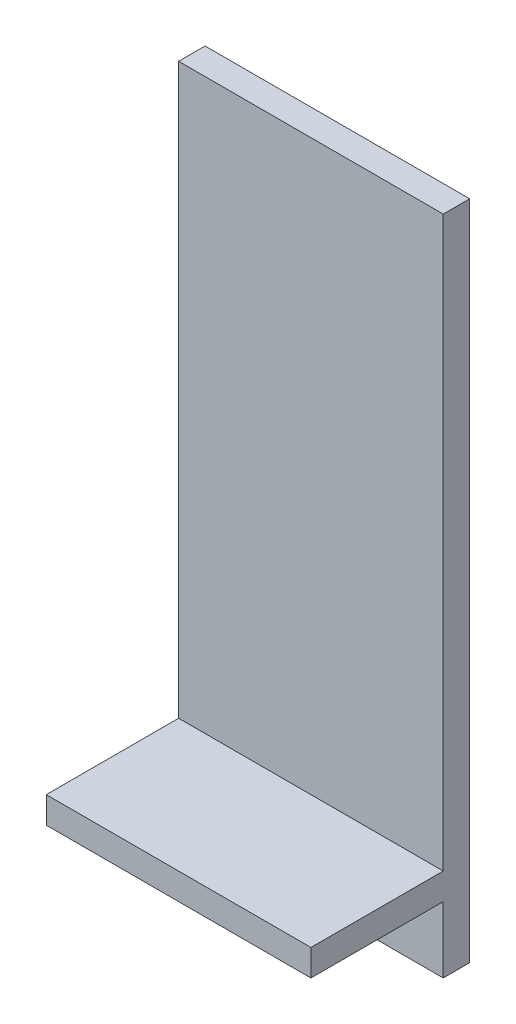
ISO-10303-21;
HEADER;
FILE_DESCRIPTION(('STEP AP214'),'2;1');
FILE_NAME('part.step','',(''),(''),'','','');
FILE_SCHEMA(('AUTOMOTIVE_DESIGN { 1 0 10303 214 1 1 1 1 }'));
ENDSEC;
DATA;
#1=APPLICATION_CONTEXT('core data for automotive mechanical design processes');
#2=APPLICATION_PROTOCOL_DEFINITION('international standard','automotive_design',2000,#1);
#3=PRODUCT_CONTEXT('',#1,'mechanical');
#4=PRODUCT('Part','Part','',(#3));
#5=PRODUCT_RELATED_PRODUCT_CATEGORY('part','',(#4));
#6=PRODUCT_DEFINITION_FORMATION('','',#4);
#7=PRODUCT_DEFINITION_CONTEXT('part definition',#1,'design');
#8=PRODUCT_DEFINITION('design','',#6,#7);
#9=PRODUCT_DEFINITION_SHAPE('','',#8);
#10=(LENGTH_UNIT() NAMED_UNIT(*) SI_UNIT(.MILLI.,.METRE.));
#11=(NAMED_UNIT(*) PLANE_ANGLE_UNIT() SI_UNIT($,.RADIAN.));
#12=(NAMED_UNIT(*) SI_UNIT($,.STERADIAN.) SOLID_ANGLE_UNIT());
#13=UNCERTAINTY_MEASURE_WITH_UNIT(LENGTH_MEASURE(1.E-05),#10,'distance_accuracy_value','');
#14=(GEOMETRIC_REPRESENTATION_CONTEXT(3) GLOBAL_UNCERTAINTY_ASSIGNED_CONTEXT((#13)) GLOBAL_UNIT_ASSIGNED_CONTEXT((#10,
#11,#12)) REPRESENTATION_CONTEXT('',''));
#15=CARTESIAN_POINT('',(0.,0.,0.));
#16=DIRECTION('',(0.,0.,1.));
#17=DIRECTION('',(1.,0.,0.));
#18=AXIS2_PLACEMENT_3D('',#15,#16,#17);
#19=CARTESIAN_POINT('',(0.,50.,0.));
#20=DIRECTION('',(0.,0.,-1.));
#21=DIRECTION('',(-1.,0.,0.));
#22=AXIS2_PLACEMENT_3D('',#19,#20,#21);
#23=PLANE('',#22);
#24=DIRECTION('',(1.,0.,0.));
#25=VECTOR('',#24,1.);
#26=CARTESIAN_POINT('',(12.,5.,0.));
#27=LINE('',#26,#25);
#28=CARTESIAN_POINT('',(0.,5.,0.));
#29=VERTEX_POINT('',#28);
#30=CARTESIAN_POINT('',(8.,5.,0.));
#31=VERTEX_POINT('',#30);
#32=EDGE_CURVE('E153',#29,#31,#27,.T.);
#33=ORIENTED_EDGE('',*,*,#32,.F.);
#34=DIRECTION('',(0.,-1.,0.));
#35=VECTOR('',#34,1.);
#36=CARTESIAN_POINT('',(0.,50.,0.));
#37=LINE('',#36,#35);
#38=CARTESIAN_POINT('',(0.,0.,0.));
#39=VERTEX_POINT('',#38);
#40=EDGE_CURVE('E41',#29,#39,#37,.T.);
#41=ORIENTED_EDGE('',*,*,#40,.T.);
#42=DIRECTION('',(1.,0.,0.));
#43=VECTOR('',#42,1.);
#44=CARTESIAN_POINT('',(0.,0.,0.));
#45=LINE('',#44,#43);
#46=CARTESIAN_POINT('',(8.,0.,0.));
#47=VERTEX_POINT('',#46);
#48=EDGE_CURVE('E56',#39,#47,#45,.T.);
#49=ORIENTED_EDGE('',*,*,#48,.T.);
#50=DIRECTION('',(0.,-1.,0.));
#51=VECTOR('',#50,1.);
#52=CARTESIAN_POINT('',(8.,0.,0.));
#53=LINE('',#52,#51);
#54=EDGE_CURVE('E165',#31,#47,#53,.T.);
#55=ORIENTED_EDGE('',*,*,#54,.F.);
#56=EDGE_LOOP('',(#33,#41,#49,#55));
#57=FACE_BOUND('',#56,.T.);
#58=ADVANCED_FACE('F33',(#57),#23,.F.);
#59=CARTESIAN_POINT('',(12.,5.,0.));
#60=VERTEX_POINT('',#59);
#61=CARTESIAN_POINT('',(20.,5.,0.));
#62=VERTEX_POINT('',#61);
#63=EDGE_CURVE('E139',#60,#62,#27,.T.);
#64=ORIENTED_EDGE('',*,*,#63,.F.);
#65=DIRECTION('',(0.,1.,0.));
#66=VECTOR('',#65,1.);
#67=CARTESIAN_POINT('',(12.,5.,0.));
#68=LINE('',#67,#66);
#69=CARTESIAN_POINT('',(12.,0.,0.));
#70=VERTEX_POINT('',#69);
#71=EDGE_CURVE('E48',#70,#60,#68,.T.);
#72=ORIENTED_EDGE('',*,*,#71,.F.);
#73=CARTESIAN_POINT('',(20.,0.,0.));
#74=VERTEX_POINT('',#73);
#75=EDGE_CURVE('E200',#70,#74,#45,.T.);
#76=ORIENTED_EDGE('',*,*,#75,.T.);
#77=DIRECTION('',(0.,-1.,0.));
#78=VECTOR('',#77,1.);
#79=CARTESIAN_POINT('',(20.,50.,0.));
#80=LINE('',#79,#78);
#81=EDGE_CURVE('E209',#62,#74,#80,.T.);
#82=ORIENTED_EDGE('',*,*,#81,.F.);
#83=EDGE_LOOP('',(#64,#72,#76,#82));
#84=FACE_BOUND('',#83,.T.);
#85=ADVANCED_FACE('F215',(#84),#23,.F.);
#86=DIRECTION('',(-1.,0.,0.));
#87=VECTOR('',#86,1.);
#88=CARTESIAN_POINT('',(20.,7.,0.));
#89=LINE('',#88,#87);
#90=CARTESIAN_POINT('',(20.,7.,0.));
#91=VERTEX_POINT('',#90);
#92=CARTESIAN_POINT('',(0.,7.,0.));
#93=VERTEX_POINT('',#92);
#94=EDGE_CURVE('E134',#91,#93,#89,.T.);
#95=ORIENTED_EDGE('',*,*,#94,.F.);
#96=CARTESIAN_POINT('',(20.,50.,0.));
#97=VERTEX_POINT('',#96);
#98=EDGE_CURVE('E210',#97,#91,#80,.T.);
#99=ORIENTED_EDGE('',*,*,#98,.F.);
#100=DIRECTION('',(1.,0.,0.));
#101=VECTOR('',#100,1.);
#102=CARTESIAN_POINT('',(0.,50.,0.));
#103=LINE('',#102,#101);
#104=CARTESIAN_POINT('',(0.,50.,0.));
#105=VERTEX_POINT('',#104);
#106=EDGE_CURVE('E190',#105,#97,#103,.T.);
#107=ORIENTED_EDGE('',*,*,#106,.F.);
#108=EDGE_CURVE('E11',#105,#93,#37,.T.);
#109=ORIENTED_EDGE('',*,*,#108,.T.);
#110=EDGE_LOOP('',(#95,#99,#107,#109));
#111=FACE_BOUND('',#110,.T.);
#112=ADVANCED_FACE('F233',(#111),#23,.F.);
#113=CARTESIAN_POINT('',(0.,50.,-2.));
#114=DIRECTION('',(1.,0.,0.));
#115=DIRECTION('',(0.,0.,-1.));
#116=AXIS2_PLACEMENT_3D('',#113,#114,#115);
#117=PLANE('',#116);
#118=DIRECTION('',(0.,0.,1.));
#119=VECTOR('',#118,1.);
#120=CARTESIAN_POINT('',(0.,0.,-2.));
#121=LINE('',#120,#119);
#122=CARTESIAN_POINT('',(0.,0.,-2.));
#123=VERTEX_POINT('',#122);
#124=EDGE_CURVE('E186',#123,#39,#121,.T.);
#125=ORIENTED_EDGE('',*,*,#124,.T.);
#126=ORIENTED_EDGE('',*,*,#40,.F.);
#127=DIRECTION('',(0.,0.,-1.));
#128=VECTOR('',#127,1.);
#129=CARTESIAN_POINT('',(0.,5.,10.));
#130=LINE('',#129,#128);
#131=CARTESIAN_POINT('',(0.,5.,10.));
#132=VERTEX_POINT('',#131);
#133=EDGE_CURVE('E152',#132,#29,#130,.T.);
#134=ORIENTED_EDGE('',*,*,#133,.F.);
#135=DIRECTION('',(0.,-1.,0.));
#136=VECTOR('',#135,1.);
#137=CARTESIAN_POINT('',(0.,7.,10.));
#138=LINE('',#137,#136);
#139=CARTESIAN_POINT('',(0.,7.,10.));
#140=VERTEX_POINT('',#139);
#141=EDGE_CURVE('E131',#140,#132,#138,.T.);
#142=ORIENTED_EDGE('',*,*,#141,.F.);
#143=DIRECTION('',(0.,0.,-1.));
#144=VECTOR('',#143,1.);
#145=CARTESIAN_POINT('',(0.,7.,10.));
#146=LINE('',#145,#144);
#147=EDGE_CURVE('E157',#140,#93,#146,.T.);
#148=ORIENTED_EDGE('',*,*,#147,.T.);
#149=ORIENTED_EDGE('',*,*,#108,.F.);
#150=DIRECTION('',(0.,0.,1.));
#151=VECTOR('',#150,1.);
#152=CARTESIAN_POINT('',(0.,50.,-2.));
#153=LINE('',#152,#151);
#154=CARTESIAN_POINT('',(0.,50.,-2.));
#155=VERTEX_POINT('',#154);
#156=EDGE_CURVE('E187',#155,#105,#153,.T.);
#157=ORIENTED_EDGE('',*,*,#156,.F.);
#158=DIRECTION('',(0.,-1.,0.));
#159=VECTOR('',#158,1.);
#160=CARTESIAN_POINT('',(0.,50.,-2.));
#161=LINE('',#160,#159);
#162=EDGE_CURVE('E197',#155,#123,#161,.T.);
#163=ORIENTED_EDGE('',*,*,#162,.T.);
#164=EDGE_LOOP('',(#125,#126,#134,#142,#148,#149,#157,#163));
#165=FACE_BOUND('',#164,.T.);
#166=ADVANCED_FACE('F35',(#165),#117,.F.);
#167=CARTESIAN_POINT('',(20.,50.,0.));
#168=DIRECTION('',(-1.,0.,0.));
#169=DIRECTION('',(0.,0.,1.));
#170=AXIS2_PLACEMENT_3D('',#167,#168,#169);
#171=PLANE('',#170);
#172=DIRECTION('',(0.,0.,-1.));
#173=VECTOR('',#172,1.);
#174=CARTESIAN_POINT('',(20.,0.,0.));
#175=LINE('',#174,#173);
#176=CARTESIAN_POINT('',(20.,0.,-2.));
#177=VERTEX_POINT('',#176);
#178=EDGE_CURVE('E202',#74,#177,#175,.T.);
#179=ORIENTED_EDGE('',*,*,#178,.T.);
#180=DIRECTION('',(0.,-1.,0.));
#181=VECTOR('',#180,1.);
#182=CARTESIAN_POINT('',(20.,50.,-2.));
#183=LINE('',#182,#181);
#184=CARTESIAN_POINT('',(20.,50.,-2.));
#185=VERTEX_POINT('',#184);
#186=EDGE_CURVE('E207',#185,#177,#183,.T.);
#187=ORIENTED_EDGE('',*,*,#186,.F.);
#188=DIRECTION('',(0.,0.,-1.));
#189=VECTOR('',#188,1.);
#190=CARTESIAN_POINT('',(20.,50.,0.));
#191=LINE('',#190,#189);
#192=EDGE_CURVE('E193',#97,#185,#191,.T.);
#193=ORIENTED_EDGE('',*,*,#192,.F.);
#194=ORIENTED_EDGE('',*,*,#98,.T.);
#195=DIRECTION('',(0.,0.,-1.));
#196=VECTOR('',#195,1.);
#197=CARTESIAN_POINT('',(20.,7.,10.));
#198=LINE('',#197,#196);
#199=CARTESIAN_POINT('',(20.,7.,10.));
#200=VERTEX_POINT('',#199);
#201=EDGE_CURVE('E142',#200,#91,#198,.T.);
#202=ORIENTED_EDGE('',*,*,#201,.F.);
#203=DIRECTION('',(0.,1.,0.));
#204=VECTOR('',#203,1.);
#205=CARTESIAN_POINT('',(20.,5.,10.));
#206=LINE('',#205,#204);
#207=CARTESIAN_POINT('',(20.,5.,10.));
#208=VERTEX_POINT('',#207);
#209=EDGE_CURVE('E128',#208,#200,#206,.T.);
#210=ORIENTED_EDGE('',*,*,#209,.F.);
#211=DIRECTION('',(0.,0.,-1.));
#212=VECTOR('',#211,1.);
#213=CARTESIAN_POINT('',(20.,5.,10.));
#214=LINE('',#213,#212);
#215=EDGE_CURVE('E137',#208,#62,#214,.T.);
#216=ORIENTED_EDGE('',*,*,#215,.T.);
#217=ORIENTED_EDGE('',*,*,#81,.T.);
#218=EDGE_LOOP('',(#179,#187,#193,#194,#202,#210,#216,#217));
#219=FACE_BOUND('',#218,.T.);
#220=ADVANCED_FACE('F144',(#219),#171,.F.);
#221=CARTESIAN_POINT('',(20.,50.,-2.));
#222=DIRECTION('',(0.,0.,1.));
#223=DIRECTION('',(1.,0.,0.));
#224=AXIS2_PLACEMENT_3D('',#221,#222,#223);
#225=PLANE('',#224);
#226=DIRECTION('',(-1.,0.,0.));
#227=VECTOR('',#226,1.);
#228=CARTESIAN_POINT('',(20.,0.,-2.));
#229=LINE('',#228,#227);
#230=EDGE_CURVE('E191',#177,#123,#229,.T.);
#231=ORIENTED_EDGE('',*,*,#230,.T.);
#232=ORIENTED_EDGE('',*,*,#162,.F.);
#233=DIRECTION('',(-1.,0.,0.));
#234=VECTOR('',#233,1.);
#235=CARTESIAN_POINT('',(20.,50.,-2.));
#236=LINE('',#235,#234);
#237=EDGE_CURVE('E195',#185,#155,#236,.T.);
#238=ORIENTED_EDGE('',*,*,#237,.F.);
#239=ORIENTED_EDGE('',*,*,#186,.T.);
#240=EDGE_LOOP('',(#231,#232,#238,#239));
#241=FACE_BOUND('',#240,.T.);
#242=ADVANCED_FACE('F223',(#241),#225,.F.);
#243=CARTESIAN_POINT('',(0.,50.,0.));
#244=DIRECTION('',(0.,1.,0.));
#245=DIRECTION('',(0.,0.,1.));
#246=AXIS2_PLACEMENT_3D('',#243,#244,#245);
#247=PLANE('',#246);
#248=ORIENTED_EDGE('',*,*,#156,.T.);
#249=ORIENTED_EDGE('',*,*,#106,.T.);
#250=ORIENTED_EDGE('',*,*,#192,.T.);
#251=ORIENTED_EDGE('',*,*,#237,.T.);
#252=EDGE_LOOP('',(#248,#249,#250,#251));
#253=FACE_BOUND('',#252,.T.);
#254=ADVANCED_FACE('F230',(#253),#247,.T.);
#255=CARTESIAN_POINT('',(0.,0.,0.));
#256=DIRECTION('',(0.,1.,0.));
#257=DIRECTION('',(0.,0.,1.));
#258=AXIS2_PLACEMENT_3D('',#255,#256,#257);
#259=PLANE('',#258);
#260=ORIENTED_EDGE('',*,*,#124,.F.);
#261=ORIENTED_EDGE('',*,*,#230,.F.);
#262=ORIENTED_EDGE('',*,*,#178,.F.);
#263=ORIENTED_EDGE('',*,*,#75,.F.);
#264=DIRECTION('',(0.,0.,-1.));
#265=VECTOR('',#264,1.);
#266=CARTESIAN_POINT('',(12.,0.,4.));
#267=LINE('',#266,#265);
#268=CARTESIAN_POINT('',(12.,0.,4.));
#269=VERTEX_POINT('',#268);
#270=EDGE_CURVE('E183',#269,#70,#267,.T.);
#271=ORIENTED_EDGE('',*,*,#270,.F.);
#272=DIRECTION('',(1.,0.,0.));
#273=VECTOR('',#272,1.);
#274=CARTESIAN_POINT('',(12.,0.,4.));
#275=LINE('',#274,#273);
#276=CARTESIAN_POINT('',(8.,0.,4.));
#277=VERTEX_POINT('',#276);
#278=EDGE_CURVE('E161',#277,#269,#275,.T.);
#279=ORIENTED_EDGE('',*,*,#278,.F.);
#280=DIRECTION('',(0.,0.,-1.));
#281=VECTOR('',#280,1.);
#282=CARTESIAN_POINT('',(8.,0.,4.));
#283=LINE('',#282,#281);
#284=EDGE_CURVE('E173',#277,#47,#283,.T.);
#285=ORIENTED_EDGE('',*,*,#284,.T.);
#286=ORIENTED_EDGE('',*,*,#48,.F.);
#287=EDGE_LOOP('',(#260,#261,#262,#263,#271,#279,#285,#286));
#288=FACE_BOUND('',#287,.T.);
#289=ADVANCED_FACE('F220',(#288),#259,.F.);
#290=CARTESIAN_POINT('',(12.,5.,4.));
#291=DIRECTION('',(-1.,0.,0.));
#292=DIRECTION('',(0.,-1.,0.));
#293=AXIS2_PLACEMENT_3D('',#290,#291,#292);
#294=PLANE('',#293);
#295=ORIENTED_EDGE('',*,*,#71,.T.);
#296=DIRECTION('',(0.,0.,-1.));
#297=VECTOR('',#296,1.);
#298=CARTESIAN_POINT('',(12.,5.,4.));
#299=LINE('',#298,#297);
#300=CARTESIAN_POINT('',(12.,5.,4.));
#301=VERTEX_POINT('',#300);
#302=EDGE_CURVE('E181',#301,#60,#299,.T.);
#303=ORIENTED_EDGE('',*,*,#302,.F.);
#304=DIRECTION('',(0.,1.,0.));
#305=VECTOR('',#304,1.);
#306=CARTESIAN_POINT('',(12.,5.,4.));
#307=LINE('',#306,#305);
#308=EDGE_CURVE('E164',#269,#301,#307,.T.);
#309=ORIENTED_EDGE('',*,*,#308,.F.);
#310=ORIENTED_EDGE('',*,*,#270,.T.);
#311=EDGE_LOOP('',(#295,#303,#309,#310));
#312=FACE_BOUND('',#311,.T.);
#313=ADVANCED_FACE('F247',(#312),#294,.F.);
#314=CARTESIAN_POINT('',(8.,0.,4.));
#315=DIRECTION('',(1.,0.,0.));
#316=DIRECTION('',(0.,0.,-1.));
#317=AXIS2_PLACEMENT_3D('',#314,#315,#316);
#318=PLANE('',#317);
#319=ORIENTED_EDGE('',*,*,#54,.T.);
#320=ORIENTED_EDGE('',*,*,#284,.F.);
#321=DIRECTION('',(0.,-1.,0.));
#322=VECTOR('',#321,1.);
#323=CARTESIAN_POINT('',(8.,0.,4.));
#324=LINE('',#323,#322);
#325=CARTESIAN_POINT('',(8.,5.,4.));
#326=VERTEX_POINT('',#325);
#327=EDGE_CURVE('E171',#326,#277,#324,.T.);
#328=ORIENTED_EDGE('',*,*,#327,.F.);
#329=DIRECTION('',(0.,0.,-1.));
#330=VECTOR('',#329,1.);
#331=CARTESIAN_POINT('',(8.,5.,4.));
#332=LINE('',#331,#330);
#333=EDGE_CURVE('E178',#326,#31,#332,.T.);
#334=ORIENTED_EDGE('',*,*,#333,.T.);
#335=EDGE_LOOP('',(#319,#320,#328,#334));
#336=FACE_BOUND('',#335,.T.);
#337=ADVANCED_FACE('F241',(#336),#318,.F.);
#338=CARTESIAN_POINT('',(0.,0.,4.));
#339=DIRECTION('',(0.,0.,-1.));
#340=DIRECTION('',(-1.,0.,0.));
#341=AXIS2_PLACEMENT_3D('',#338,#339,#340);
#342=PLANE('',#341);
#343=ORIENTED_EDGE('',*,*,#278,.T.);
#344=ORIENTED_EDGE('',*,*,#308,.T.);
#345=DIRECTION('',(-1.,0.,0.));
#346=VECTOR('',#345,1.);
#347=CARTESIAN_POINT('',(8.,5.,4.));
#348=LINE('',#347,#346);
#349=EDGE_CURVE('E168',#301,#326,#348,.T.);
#350=ORIENTED_EDGE('',*,*,#349,.T.);
#351=ORIENTED_EDGE('',*,*,#327,.T.);
#352=EDGE_LOOP('',(#343,#344,#350,#351));
#353=FACE_BOUND('',#352,.T.);
#354=ADVANCED_FACE('F243',(#353),#342,.F.);
#355=CARTESIAN_POINT('',(12.,5.,10.));
#356=DIRECTION('',(0.,1.,0.));
#357=DIRECTION('',(-1.,0.,0.));
#358=AXIS2_PLACEMENT_3D('',#355,#356,#357);
#359=PLANE('',#358);
#360=ORIENTED_EDGE('',*,*,#349,.F.);
#361=ORIENTED_EDGE('',*,*,#302,.T.);
#362=ORIENTED_EDGE('',*,*,#63,.T.);
#363=ORIENTED_EDGE('',*,*,#215,.F.);
#364=DIRECTION('',(1.,0.,0.));
#365=VECTOR('',#364,1.);
#366=CARTESIAN_POINT('',(0.,5.,10.));
#367=LINE('',#366,#365);
#368=EDGE_CURVE('E124',#132,#208,#367,.T.);
#369=ORIENTED_EDGE('',*,*,#368,.F.);
#370=ORIENTED_EDGE('',*,*,#133,.T.);
#371=ORIENTED_EDGE('',*,*,#32,.T.);
#372=ORIENTED_EDGE('',*,*,#333,.F.);
#373=EDGE_LOOP('',(#360,#361,#362,#363,#369,#370,#371,#372));
#374=FACE_BOUND('',#373,.T.);
#375=ADVANCED_FACE('F138',(#374),#359,.F.);
#376=CARTESIAN_POINT('',(20.,7.,10.));
#377=DIRECTION('',(0.,-1.,0.));
#378=DIRECTION('',(1.,0.,0.));
#379=AXIS2_PLACEMENT_3D('',#376,#377,#378);
#380=PLANE('',#379);
#381=ORIENTED_EDGE('',*,*,#94,.T.);
#382=ORIENTED_EDGE('',*,*,#147,.F.);
#383=DIRECTION('',(-1.,0.,0.));
#384=VECTOR('',#383,1.);
#385=CARTESIAN_POINT('',(20.,7.,10.));
#386=LINE('',#385,#384);
#387=EDGE_CURVE('E147',#200,#140,#386,.T.);
#388=ORIENTED_EDGE('',*,*,#387,.F.);
#389=ORIENTED_EDGE('',*,*,#201,.T.);
#390=EDGE_LOOP('',(#381,#382,#388,#389));
#391=FACE_BOUND('',#390,.T.);
#392=ADVANCED_FACE('F236',(#391),#380,.F.);
#393=CARTESIAN_POINT('',(0.,0.,10.));
#394=DIRECTION('',(0.,0.,1.));
#395=DIRECTION('',(1.,0.,0.));
#396=AXIS2_PLACEMENT_3D('',#393,#394,#395);
#397=PLANE('',#396);
#398=ORIENTED_EDGE('',*,*,#368,.T.);
#399=ORIENTED_EDGE('',*,*,#209,.T.);
#400=ORIENTED_EDGE('',*,*,#387,.T.);
#401=ORIENTED_EDGE('',*,*,#141,.T.);
#402=EDGE_LOOP('',(#398,#399,#400,#401));
#403=FACE_BOUND('',#402,.T.);
#404=ADVANCED_FACE('F126',(#403),#397,.T.);
#405=CLOSED_SHELL('',(#58,#85,#112,#166,#220,#242,#254,#289,#313,#337,#354,#375,#392,#404));
#406=MANIFOLD_SOLID_BREP('B2',#405);
#407=ADVANCED_BREP_SHAPE_REPRESENTATION('',(#18,#406),#14);
#408=SHAPE_DEFINITION_REPRESENTATION(#9,#407);
ENDSEC;
END-ISO-10303-21;
